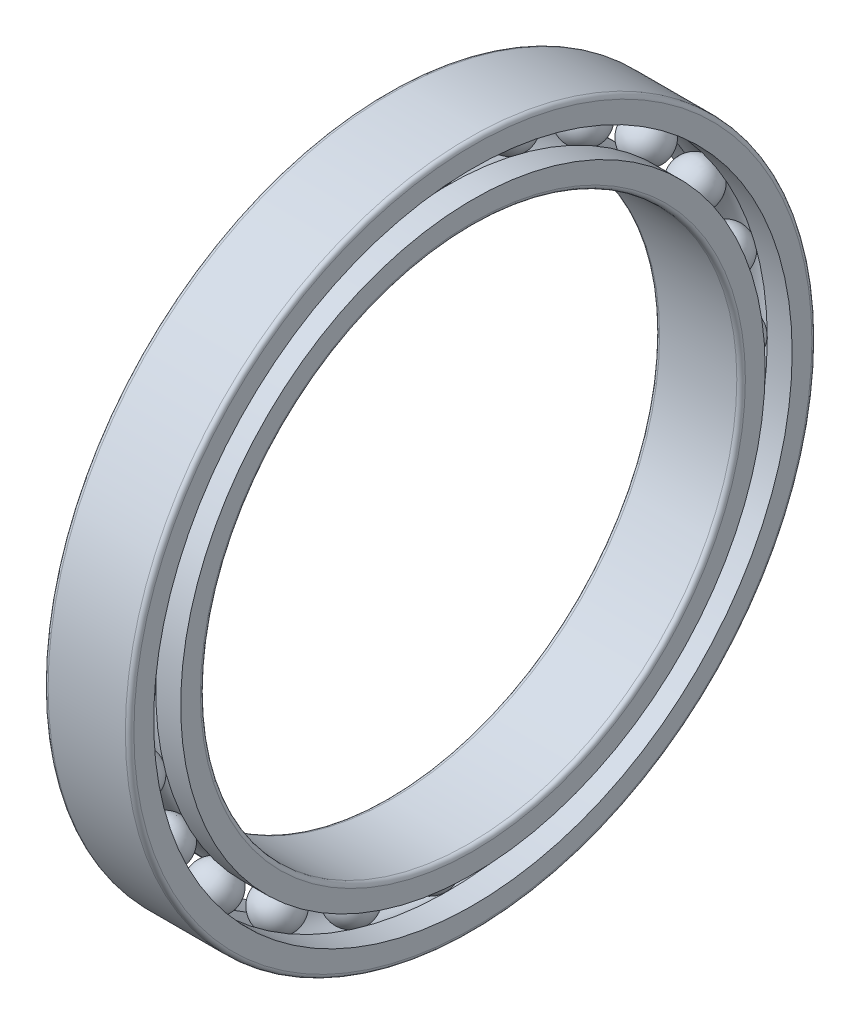
ISO-10303-21;
HEADER;
FILE_DESCRIPTION(('STEP AP214'),'2;1');
FILE_NAME('part.step','',(''),(''),'','','');
FILE_SCHEMA(('AUTOMOTIVE_DESIGN { 1 0 10303 214 1 1 1 1 }'));
ENDSEC;
DATA;
#1=APPLICATION_CONTEXT('core data for automotive mechanical design processes');
#2=APPLICATION_PROTOCOL_DEFINITION('international standard','automotive_design',2000,#1);
#3=PRODUCT_CONTEXT('',#1,'mechanical');
#4=PRODUCT('Part','Part','',(#3));
#5=PRODUCT_RELATED_PRODUCT_CATEGORY('part','',(#4));
#6=PRODUCT_DEFINITION_FORMATION('','',#4);
#7=PRODUCT_DEFINITION_CONTEXT('part definition',#1,'design');
#8=PRODUCT_DEFINITION('design','',#6,#7);
#9=PRODUCT_DEFINITION_SHAPE('','',#8);
#10=(LENGTH_UNIT() NAMED_UNIT(*) SI_UNIT(.MILLI.,.METRE.));
#11=(NAMED_UNIT(*) PLANE_ANGLE_UNIT() SI_UNIT($,.RADIAN.));
#12=(NAMED_UNIT(*) SI_UNIT($,.STERADIAN.) SOLID_ANGLE_UNIT());
#13=UNCERTAINTY_MEASURE_WITH_UNIT(LENGTH_MEASURE(1.E-05),#10,'distance_accuracy_value','');
#14=(GEOMETRIC_REPRESENTATION_CONTEXT(3) GLOBAL_UNCERTAINTY_ASSIGNED_CONTEXT((#13)) GLOBAL_UNIT_ASSIGNED_CONTEXT((#10,
#11,#12)) REPRESENTATION_CONTEXT('',''));
#15=CARTESIAN_POINT('',(0.,0.,0.));
#16=DIRECTION('',(0.,0.,1.));
#17=DIRECTION('',(1.,0.,0.));
#18=AXIS2_PLACEMENT_3D('',#15,#16,#17);
#19=CARTESIAN_POINT('',(2.,14.25,0.));
#20=DIRECTION('',(-1.,0.,0.));
#21=DIRECTION('',(0.,1.,0.));
#22=AXIS2_PLACEMENT_3D('',#19,#20,#21);
#23=SPHERICAL_SURFACE('',#22,1.0325);
#24=CARTESIAN_POINT('',(3.0325,14.25,0.));
#25=VERTEX_POINT('',#24);
#26=VERTEX_LOOP('',#25);
#27=FACE_BOUND('',#26,.T.);
#28=ADVANCED_FACE('P0_F14',(#27),#23,.T.);
#29=CLOSED_SHELL('',(#28));
#30=MANIFOLD_SOLID_BREP('P0_B1',#29);
#31=CARTESIAN_POINT('',(2.,13.764443024619,3.688171392711));
#32=DIRECTION('',(-1.,0.,0.));
#33=DIRECTION('',(0.,1.,0.));
#34=AXIS2_PLACEMENT_3D('',#31,#32,#33);
#35=SPHERICAL_SURFACE('',#34,1.0325);
#36=CARTESIAN_POINT('',(3.0325,13.764443024619,3.688171392711));
#37=VERTEX_POINT('',#36);
#38=VERTEX_LOOP('',#37);
#39=FACE_BOUND('',#38,.T.);
#40=ADVANCED_FACE('P1_F14',(#39),#35,.T.);
#41=CLOSED_SHELL('',(#40));
#42=MANIFOLD_SOLID_BREP('P1_B1',#41);
#43=CARTESIAN_POINT('',(2.,12.340862003928,7.125));
#44=DIRECTION('',(-1.,0.,0.));
#45=DIRECTION('',(0.,1.,0.));
#46=AXIS2_PLACEMENT_3D('',#43,#44,#45);
#47=SPHERICAL_SURFACE('',#46,1.0325);
#48=CARTESIAN_POINT('',(3.0325,12.340862003928,7.125));
#49=VERTEX_POINT('',#48);
#50=VERTEX_LOOP('',#49);
#51=FACE_BOUND('',#50,.T.);
#52=ADVANCED_FACE('P2_F14',(#51),#47,.T.);
#53=CLOSED_SHELL('',(#52));
#54=MANIFOLD_SOLID_BREP('P2_B1',#53);
#55=CARTESIAN_POINT('',(2.,10.076271631908,10.076271631908));
#56=DIRECTION('',(-1.,0.,0.));
#57=DIRECTION('',(0.,1.,0.));
#58=AXIS2_PLACEMENT_3D('',#55,#56,#57);
#59=SPHERICAL_SURFACE('',#58,1.0325);
#60=CARTESIAN_POINT('',(3.0325,10.076271631908,10.076271631908));
#61=VERTEX_POINT('',#60);
#62=VERTEX_LOOP('',#61);
#63=FACE_BOUND('',#62,.T.);
#64=ADVANCED_FACE('P3_F14',(#63),#59,.T.);
#65=CLOSED_SHELL('',(#64));
#66=MANIFOLD_SOLID_BREP('P3_B1',#65);
#67=CARTESIAN_POINT('',(2.,7.125,12.340862003928));
#68=DIRECTION('',(-1.,0.,0.));
#69=DIRECTION('',(0.,1.,0.));
#70=AXIS2_PLACEMENT_3D('',#67,#68,#69);
#71=SPHERICAL_SURFACE('',#70,1.0325);
#72=CARTESIAN_POINT('',(3.0325,7.125,12.340862003928));
#73=VERTEX_POINT('',#72);
#74=VERTEX_LOOP('',#73);
#75=FACE_BOUND('',#74,.T.);
#76=ADVANCED_FACE('P4_F14',(#75),#71,.T.);
#77=CLOSED_SHELL('',(#76));
#78=MANIFOLD_SOLID_BREP('P4_B1',#77);
#79=CARTESIAN_POINT('',(2.,3.688171392711,13.764443024619));
#80=DIRECTION('',(-1.,0.,0.));
#81=DIRECTION('',(0.,1.,0.));
#82=AXIS2_PLACEMENT_3D('',#79,#80,#81);
#83=SPHERICAL_SURFACE('',#82,1.0325);
#84=CARTESIAN_POINT('',(3.0325,3.688171392711,13.764443024619));
#85=VERTEX_POINT('',#84);
#86=VERTEX_LOOP('',#85);
#87=FACE_BOUND('',#86,.T.);
#88=ADVANCED_FACE('P5_F14',(#87),#83,.T.);
#89=CLOSED_SHELL('',(#88));
#90=MANIFOLD_SOLID_BREP('P5_B1',#89);
#91=CARTESIAN_POINT('',(2.,0.,14.25));
#92=DIRECTION('',(-1.,0.,0.));
#93=DIRECTION('',(0.,1.,0.));
#94=AXIS2_PLACEMENT_3D('',#91,#92,#93);
#95=SPHERICAL_SURFACE('',#94,1.0325);
#96=CARTESIAN_POINT('',(3.0325,0.,14.25));
#97=VERTEX_POINT('',#96);
#98=VERTEX_LOOP('',#97);
#99=FACE_BOUND('',#98,.T.);
#100=ADVANCED_FACE('P6_F14',(#99),#95,.T.);
#101=CLOSED_SHELL('',(#100));
#102=MANIFOLD_SOLID_BREP('P6_B1',#101);
#103=CARTESIAN_POINT('',(2.,-3.688171392711,13.764443024619));
#104=DIRECTION('',(-1.,0.,0.));
#105=DIRECTION('',(0.,1.,0.));
#106=AXIS2_PLACEMENT_3D('',#103,#104,#105);
#107=SPHERICAL_SURFACE('',#106,1.0325);
#108=CARTESIAN_POINT('',(3.0325,-3.688171392711,13.764443024619));
#109=VERTEX_POINT('',#108);
#110=VERTEX_LOOP('',#109);
#111=FACE_BOUND('',#110,.T.);
#112=ADVANCED_FACE('P7_F14',(#111),#107,.T.);
#113=CLOSED_SHELL('',(#112));
#114=MANIFOLD_SOLID_BREP('P7_B1',#113);
#115=CARTESIAN_POINT('',(2.,-10.076271631908,10.076271631908));
#116=DIRECTION('',(-1.,0.,0.));
#117=DIRECTION('',(0.,1.,0.));
#118=AXIS2_PLACEMENT_3D('',#115,#116,#117);
#119=SPHERICAL_SURFACE('',#118,1.0325);
#120=CARTESIAN_POINT('',(3.0325,-10.076271631908,10.076271631908));
#121=VERTEX_POINT('',#120);
#122=VERTEX_LOOP('',#121);
#123=FACE_BOUND('',#122,.T.);
#124=ADVANCED_FACE('P8_F14',(#123),#119,.T.);
#125=CLOSED_SHELL('',(#124));
#126=MANIFOLD_SOLID_BREP('P8_B1',#125);
#127=CARTESIAN_POINT('',(2.,-12.340862003928,7.125));
#128=DIRECTION('',(-1.,0.,0.));
#129=DIRECTION('',(0.,1.,0.));
#130=AXIS2_PLACEMENT_3D('',#127,#128,#129);
#131=SPHERICAL_SURFACE('',#130,1.0325);
#132=CARTESIAN_POINT('',(3.0325,-12.340862003928,7.125));
#133=VERTEX_POINT('',#132);
#134=VERTEX_LOOP('',#133);
#135=FACE_BOUND('',#134,.T.);
#136=ADVANCED_FACE('P9_F14',(#135),#131,.T.);
#137=CLOSED_SHELL('',(#136));
#138=MANIFOLD_SOLID_BREP('P9_B1',#137);
#139=CARTESIAN_POINT('',(2.,-13.764443024619,3.688171392711));
#140=DIRECTION('',(-1.,0.,0.));
#141=DIRECTION('',(0.,1.,0.));
#142=AXIS2_PLACEMENT_3D('',#139,#140,#141);
#143=SPHERICAL_SURFACE('',#142,1.0325);
#144=CARTESIAN_POINT('',(3.0325,-13.764443024619,3.688171392711));
#145=VERTEX_POINT('',#144);
#146=VERTEX_LOOP('',#145);
#147=FACE_BOUND('',#146,.T.);
#148=ADVANCED_FACE('P10_F14',(#147),#143,.T.);
#149=CLOSED_SHELL('',(#148));
#150=MANIFOLD_SOLID_BREP('P10_B1',#149);
#151=CARTESIAN_POINT('',(2.,-14.25,0.));
#152=DIRECTION('',(-1.,0.,0.));
#153=DIRECTION('',(0.,1.,0.));
#154=AXIS2_PLACEMENT_3D('',#151,#152,#153);
#155=SPHERICAL_SURFACE('',#154,1.0325);
#156=CARTESIAN_POINT('',(3.0325,-14.25,0.));
#157=VERTEX_POINT('',#156);
#158=VERTEX_LOOP('',#157);
#159=FACE_BOUND('',#158,.T.);
#160=ADVANCED_FACE('P11_F14',(#159),#155,.T.);
#161=CLOSED_SHELL('',(#160));
#162=MANIFOLD_SOLID_BREP('P11_B1',#161);
#163=CARTESIAN_POINT('',(2.,-13.764443024619,-3.688171392711));
#164=DIRECTION('',(-1.,0.,0.));
#165=DIRECTION('',(0.,1.,0.));
#166=AXIS2_PLACEMENT_3D('',#163,#164,#165);
#167=SPHERICAL_SURFACE('',#166,1.0325);
#168=CARTESIAN_POINT('',(3.0325,-13.764443024619,-3.688171392711));
#169=VERTEX_POINT('',#168);
#170=VERTEX_LOOP('',#169);
#171=FACE_BOUND('',#170,.T.);
#172=ADVANCED_FACE('P12_F14',(#171),#167,.T.);
#173=CLOSED_SHELL('',(#172));
#174=MANIFOLD_SOLID_BREP('P12_B1',#173);
#175=CARTESIAN_POINT('',(2.,-12.340862003928,-7.125));
#176=DIRECTION('',(-1.,0.,0.));
#177=DIRECTION('',(0.,1.,0.));
#178=AXIS2_PLACEMENT_3D('',#175,#176,#177);
#179=SPHERICAL_SURFACE('',#178,1.0325);
#180=CARTESIAN_POINT('',(3.0325,-12.340862003928,-7.125));
#181=VERTEX_POINT('',#180);
#182=VERTEX_LOOP('',#181);
#183=FACE_BOUND('',#182,.T.);
#184=ADVANCED_FACE('P13_F14',(#183),#179,.T.);
#185=CLOSED_SHELL('',(#184));
#186=MANIFOLD_SOLID_BREP('P13_B1',#185);
#187=CARTESIAN_POINT('',(2.,-10.076271631908,-10.076271631908));
#188=DIRECTION('',(-1.,0.,0.));
#189=DIRECTION('',(0.,1.,0.));
#190=AXIS2_PLACEMENT_3D('',#187,#188,#189);
#191=SPHERICAL_SURFACE('',#190,1.0325);
#192=CARTESIAN_POINT('',(3.0325,-10.076271631908,-10.076271631908));
#193=VERTEX_POINT('',#192);
#194=VERTEX_LOOP('',#193);
#195=FACE_BOUND('',#194,.T.);
#196=ADVANCED_FACE('P14_F14',(#195),#191,.T.);
#197=CLOSED_SHELL('',(#196));
#198=MANIFOLD_SOLID_BREP('P14_B1',#197);
#199=CARTESIAN_POINT('',(2.,-7.125,-12.340862003928));
#200=DIRECTION('',(-1.,0.,0.));
#201=DIRECTION('',(0.,1.,0.));
#202=AXIS2_PLACEMENT_3D('',#199,#200,#201);
#203=SPHERICAL_SURFACE('',#202,1.0325);
#204=CARTESIAN_POINT('',(3.0325,-7.125,-12.340862003928));
#205=VERTEX_POINT('',#204);
#206=VERTEX_LOOP('',#205);
#207=FACE_BOUND('',#206,.T.);
#208=ADVANCED_FACE('P15_F14',(#207),#203,.T.);
#209=CLOSED_SHELL('',(#208));
#210=MANIFOLD_SOLID_BREP('P15_B1',#209);
#211=CARTESIAN_POINT('',(2.,-3.688171392711,-13.764443024619));
#212=DIRECTION('',(-1.,0.,0.));
#213=DIRECTION('',(0.,1.,0.));
#214=AXIS2_PLACEMENT_3D('',#211,#212,#213);
#215=SPHERICAL_SURFACE('',#214,1.0325);
#216=CARTESIAN_POINT('',(3.0325,-3.688171392711,-13.764443024619));
#217=VERTEX_POINT('',#216);
#218=VERTEX_LOOP('',#217);
#219=FACE_BOUND('',#218,.T.);
#220=ADVANCED_FACE('P16_F14',(#219),#215,.T.);
#221=CLOSED_SHELL('',(#220));
#222=MANIFOLD_SOLID_BREP('P16_B1',#221);
#223=CARTESIAN_POINT('',(2.,0.,-14.25));
#224=DIRECTION('',(-1.,0.,0.));
#225=DIRECTION('',(0.,1.,0.));
#226=AXIS2_PLACEMENT_3D('',#223,#224,#225);
#227=SPHERICAL_SURFACE('',#226,1.0325);
#228=CARTESIAN_POINT('',(3.0325,0.,-14.25));
#229=VERTEX_POINT('',#228);
#230=VERTEX_LOOP('',#229);
#231=FACE_BOUND('',#230,.T.);
#232=ADVANCED_FACE('P17_F14',(#231),#227,.T.);
#233=CLOSED_SHELL('',(#232));
#234=MANIFOLD_SOLID_BREP('P17_B1',#233);
#235=CARTESIAN_POINT('',(2.,3.688171392711,-13.764443024619));
#236=DIRECTION('',(-1.,0.,0.));
#237=DIRECTION('',(0.,1.,0.));
#238=AXIS2_PLACEMENT_3D('',#235,#236,#237);
#239=SPHERICAL_SURFACE('',#238,1.0325);
#240=CARTESIAN_POINT('',(3.0325,3.688171392711,-13.764443024619));
#241=VERTEX_POINT('',#240);
#242=VERTEX_LOOP('',#241);
#243=FACE_BOUND('',#242,.T.);
#244=ADVANCED_FACE('P18_F14',(#243),#239,.T.);
#245=CLOSED_SHELL('',(#244));
#246=MANIFOLD_SOLID_BREP('P18_B1',#245);
#247=CARTESIAN_POINT('',(2.,7.125,-12.340862003928));
#248=DIRECTION('',(-1.,0.,0.));
#249=DIRECTION('',(0.,1.,0.));
#250=AXIS2_PLACEMENT_3D('',#247,#248,#249);
#251=SPHERICAL_SURFACE('',#250,1.0325);
#252=CARTESIAN_POINT('',(3.0325,7.125,-12.340862003928));
#253=VERTEX_POINT('',#252);
#254=VERTEX_LOOP('',#253);
#255=FACE_BOUND('',#254,.T.);
#256=ADVANCED_FACE('P19_F14',(#255),#251,.T.);
#257=CLOSED_SHELL('',(#256));
#258=MANIFOLD_SOLID_BREP('P19_B1',#257);
#259=CARTESIAN_POINT('',(2.,10.076271631908,-10.076271631908));
#260=DIRECTION('',(-1.,0.,0.));
#261=DIRECTION('',(0.,1.,0.));
#262=AXIS2_PLACEMENT_3D('',#259,#260,#261);
#263=SPHERICAL_SURFACE('',#262,1.0325);
#264=CARTESIAN_POINT('',(3.0325,10.076271631908,-10.076271631908));
#265=VERTEX_POINT('',#264);
#266=VERTEX_LOOP('',#265);
#267=FACE_BOUND('',#266,.T.);
#268=ADVANCED_FACE('P20_F14',(#267),#263,.T.);
#269=CLOSED_SHELL('',(#268));
#270=MANIFOLD_SOLID_BREP('P20_B1',#269);
#271=CARTESIAN_POINT('',(2.,12.340862003928,-7.125));
#272=DIRECTION('',(-1.,0.,0.));
#273=DIRECTION('',(0.,1.,0.));
#274=AXIS2_PLACEMENT_3D('',#271,#272,#273);
#275=SPHERICAL_SURFACE('',#274,1.0325);
#276=CARTESIAN_POINT('',(3.0325,12.340862003928,-7.125));
#277=VERTEX_POINT('',#276);
#278=VERTEX_LOOP('',#277);
#279=FACE_BOUND('',#278,.T.);
#280=ADVANCED_FACE('P21_F14',(#279),#275,.T.);
#281=CLOSED_SHELL('',(#280));
#282=MANIFOLD_SOLID_BREP('P21_B1',#281);
#283=CARTESIAN_POINT('',(2.,13.764443024619,-3.688171392711));
#284=DIRECTION('',(-1.,0.,0.));
#285=DIRECTION('',(0.,1.,0.));
#286=AXIS2_PLACEMENT_3D('',#283,#284,#285);
#287=SPHERICAL_SURFACE('',#286,1.0325);
#288=CARTESIAN_POINT('',(3.0325,13.764443024619,-3.688171392711));
#289=VERTEX_POINT('',#288);
#290=VERTEX_LOOP('',#289);
#291=FACE_BOUND('',#290,.T.);
#292=ADVANCED_FACE('P22_F14',(#291),#287,.T.);
#293=CLOSED_SHELL('',(#292));
#294=MANIFOLD_SOLID_BREP('P22_B1',#293);
#295=CARTESIAN_POINT('',(2.,-7.125,12.340862003928));
#296=DIRECTION('',(-1.,0.,0.));
#297=DIRECTION('',(0.,1.,0.));
#298=AXIS2_PLACEMENT_3D('',#295,#296,#297);
#299=SPHERICAL_SURFACE('',#298,1.0325);
#300=CARTESIAN_POINT('',(3.0325,-7.125,12.340862003928));
#301=VERTEX_POINT('',#300);
#302=VERTEX_LOOP('',#301);
#303=FACE_BOUND('',#302,.T.);
#304=ADVANCED_FACE('P23_F14',(#303),#299,.T.);
#305=CLOSED_SHELL('',(#304));
#306=MANIFOLD_SOLID_BREP('P23_B1',#305);
#307=CARTESIAN_POINT('',(4.,0.,0.));
#308=DIRECTION('',(1.,0.,0.));
#309=DIRECTION('',(0.,0.,-1.));
#310=AXIS2_PLACEMENT_3D('',#307,#308,#309);
#311=CYLINDRICAL_SURFACE('',#310,13.62);
#312=CARTESIAN_POINT('',(1.16,0.,0.));
#313=DIRECTION('',(1.,0.,0.));
#314=DIRECTION('',(0.,0.,-1.));
#315=AXIS2_PLACEMENT_3D('',#312,#313,#314);
#316=CIRCLE('',#315,13.62);
#317=CARTESIAN_POINT('',(1.16,0.,-13.62));
#318=VERTEX_POINT('',#317);
#319=EDGE_CURVE('P24_E11',#318,#318,#316,.T.);
#320=ORIENTED_EDGE('',*,*,#319,.F.);
#321=EDGE_LOOP('',(#320));
#322=FACE_BOUND('',#321,.T.);
#323=CARTESIAN_POINT('',(0.,0.,0.));
#324=DIRECTION('',(1.,0.,0.));
#325=DIRECTION('',(0.,0.,-1.));
#326=AXIS2_PLACEMENT_3D('',#323,#324,#325);
#327=CIRCLE('',#326,13.62);
#328=CARTESIAN_POINT('',(0.,0.,-13.62));
#329=VERTEX_POINT('',#328);
#330=EDGE_CURVE('P24_E71',#329,#329,#327,.T.);
#331=ORIENTED_EDGE('',*,*,#330,.T.);
#332=EDGE_LOOP('',(#331));
#333=FACE_BOUND('',#332,.T.);
#334=ADVANCED_FACE('P24_F16',(#322,#333),#311,.T.);
#335=CARTESIAN_POINT('',(2.,0.,0.));
#336=DIRECTION('',(1.,0.,0.));
#337=DIRECTION('',(0.,0.,-1.));
#338=AXIS2_PLACEMENT_3D('',#335,#336,#337);
#339=TOROIDAL_SURFACE('',#338,14.25,1.05);
#340=ORIENTED_EDGE('',*,*,#319,.T.);
#341=EDGE_LOOP('',(#340));
#342=FACE_BOUND('',#341,.T.);
#343=CARTESIAN_POINT('',(2.84,0.,0.));
#344=DIRECTION('',(1.,0.,0.));
#345=DIRECTION('',(0.,0.,-1.));
#346=AXIS2_PLACEMENT_3D('',#343,#344,#345);
#347=CIRCLE('',#346,13.62);
#348=CARTESIAN_POINT('',(2.84,0.,-13.62));
#349=VERTEX_POINT('',#348);
#350=EDGE_CURVE('P24_E25',#349,#349,#347,.T.);
#351=ORIENTED_EDGE('',*,*,#350,.F.);
#352=EDGE_LOOP('',(#351));
#353=FACE_BOUND('',#352,.T.);
#354=ADVANCED_FACE('P24_F164',(#342,#353),#339,.F.);
#355=CARTESIAN_POINT('',(4.,0.,0.));
#356=DIRECTION('',(1.,0.,0.));
#357=DIRECTION('',(0.,0.,-1.));
#358=AXIS2_PLACEMENT_3D('',#355,#356,#357);
#359=CYLINDRICAL_SURFACE('',#358,13.62);
#360=CARTESIAN_POINT('',(4.,0.,0.));
#361=DIRECTION('',(1.,0.,0.));
#362=DIRECTION('',(0.,0.,-1.));
#363=AXIS2_PLACEMENT_3D('',#360,#361,#362);
#364=CIRCLE('',#363,13.62);
#365=CARTESIAN_POINT('',(4.,0.,-13.62));
#366=VERTEX_POINT('',#365);
#367=EDGE_CURVE('P24_E45',#366,#366,#364,.T.);
#368=ORIENTED_EDGE('',*,*,#367,.F.);
#369=EDGE_LOOP('',(#368));
#370=FACE_BOUND('',#369,.T.);
#371=ORIENTED_EDGE('',*,*,#350,.T.);
#372=EDGE_LOOP('',(#371));
#373=FACE_BOUND('',#372,.T.);
#374=ADVANCED_FACE('P24_F155',(#370,#373),#359,.T.);
#375=CARTESIAN_POINT('',(4.,12.7,0.));
#376=DIRECTION('',(1.,0.,0.));
#377=DIRECTION('',(0.,1.,0.));
#378=AXIS2_PLACEMENT_3D('',#375,#376,#377);
#379=PLANE('',#378);
#380=CARTESIAN_POINT('',(4.,0.,0.));
#381=DIRECTION('',(1.,0.,0.));
#382=DIRECTION('',(0.,0.,-1.));
#383=AXIS2_PLACEMENT_3D('',#380,#381,#382);
#384=CIRCLE('',#383,12.7);
#385=CARTESIAN_POINT('',(4.,0.,-12.7));
#386=VERTEX_POINT('',#385);
#387=EDGE_CURVE('P24_E53',#386,#386,#384,.T.);
#388=ORIENTED_EDGE('',*,*,#387,.F.);
#389=EDGE_LOOP('',(#388));
#390=FACE_BOUND('',#389,.T.);
#391=ORIENTED_EDGE('',*,*,#367,.T.);
#392=EDGE_LOOP('',(#391));
#393=FACE_BOUND('',#392,.T.);
#394=ADVANCED_FACE('P24_F132',(#390,#393),#379,.T.);
#395=CARTESIAN_POINT('',(3.8,0.,0.));
#396=DIRECTION('',(1.,0.,0.));
#397=DIRECTION('',(0.,0.,-1.));
#398=AXIS2_PLACEMENT_3D('',#395,#396,#397);
#399=TOROIDAL_SURFACE('',#398,12.7,0.2);
#400=CARTESIAN_POINT('',(3.8,0.,0.));
#401=DIRECTION('',(1.,0.,0.));
#402=DIRECTION('',(0.,0.,-1.));
#403=AXIS2_PLACEMENT_3D('',#400,#401,#402);
#404=CIRCLE('',#403,12.5);
#405=CARTESIAN_POINT('',(3.8,0.,-12.5));
#406=VERTEX_POINT('',#405);
#407=EDGE_CURVE('P24_E84',#406,#406,#404,.T.);
#408=ORIENTED_EDGE('',*,*,#407,.F.);
#409=EDGE_LOOP('',(#408));
#410=FACE_BOUND('',#409,.T.);
#411=ORIENTED_EDGE('',*,*,#387,.T.);
#412=EDGE_LOOP('',(#411));
#413=FACE_BOUND('',#412,.T.);
#414=ADVANCED_FACE('P24_F126',(#410,#413),#399,.T.);
#415=CARTESIAN_POINT('',(4.,0.,0.));
#416=DIRECTION('',(1.,0.,0.));
#417=DIRECTION('',(0.,0.,-1.));
#418=AXIS2_PLACEMENT_3D('',#415,#416,#417);
#419=CYLINDRICAL_SURFACE('',#418,12.5);
#420=CARTESIAN_POINT('',(0.2,0.,0.));
#421=DIRECTION('',(1.,0.,0.));
#422=DIRECTION('',(0.,0.,-1.));
#423=AXIS2_PLACEMENT_3D('',#420,#421,#422);
#424=CIRCLE('',#423,12.5);
#425=CARTESIAN_POINT('',(0.2,0.,-12.5));
#426=VERTEX_POINT('',#425);
#427=EDGE_CURVE('P24_E77',#426,#426,#424,.T.);
#428=ORIENTED_EDGE('',*,*,#427,.F.);
#429=EDGE_LOOP('',(#428));
#430=FACE_BOUND('',#429,.T.);
#431=ORIENTED_EDGE('',*,*,#407,.T.);
#432=EDGE_LOOP('',(#431));
#433=FACE_BOUND('',#432,.T.);
#434=ADVANCED_FACE('P24_F131',(#430,#433),#419,.F.);
#435=CARTESIAN_POINT('',(0.2,0.,0.));
#436=DIRECTION('',(1.,0.,0.));
#437=DIRECTION('',(0.,0.,-1.));
#438=AXIS2_PLACEMENT_3D('',#435,#436,#437);
#439=TOROIDAL_SURFACE('',#438,12.7,0.2);
#440=CARTESIAN_POINT('',(0.,0.,0.));
#441=DIRECTION('',(1.,0.,0.));
#442=DIRECTION('',(0.,0.,-1.));
#443=AXIS2_PLACEMENT_3D('',#440,#441,#442);
#444=CIRCLE('',#443,12.7);
#445=CARTESIAN_POINT('',(0.,0.,-12.7));
#446=VERTEX_POINT('',#445);
#447=EDGE_CURVE('P24_E67',#446,#446,#444,.T.);
#448=ORIENTED_EDGE('',*,*,#447,.F.);
#449=EDGE_LOOP('',(#448));
#450=FACE_BOUND('',#449,.T.);
#451=ORIENTED_EDGE('',*,*,#427,.T.);
#452=EDGE_LOOP('',(#451));
#453=FACE_BOUND('',#452,.T.);
#454=ADVANCED_FACE('P24_F120',(#450,#453),#439,.T.);
#455=CARTESIAN_POINT('',(0.,13.62,0.));
#456=DIRECTION('',(-1.,0.,0.));
#457=DIRECTION('',(0.,0.,1.));
#458=AXIS2_PLACEMENT_3D('',#455,#456,#457);
#459=PLANE('',#458);
#460=ORIENTED_EDGE('',*,*,#330,.F.);
#461=EDGE_LOOP('',(#460));
#462=FACE_BOUND('',#461,.T.);
#463=ORIENTED_EDGE('',*,*,#447,.T.);
#464=EDGE_LOOP('',(#463));
#465=FACE_BOUND('',#464,.T.);
#466=ADVANCED_FACE('P24_F68',(#462,#465),#459,.T.);
#467=CLOSED_SHELL('',(#334,#354,#374,#394,#414,#434,#454,#466));
#468=MANIFOLD_SOLID_BREP('P24_B1',#467);
#469=CARTESIAN_POINT('',(0.2,0.,0.));
#470=DIRECTION('',(1.,0.,0.));
#471=DIRECTION('',(0.,0.,-1.));
#472=AXIS2_PLACEMENT_3D('',#469,#470,#471);
#473=TOROIDAL_SURFACE('',#472,15.8,0.2);
#474=CARTESIAN_POINT('',(0.2,0.,0.));
#475=DIRECTION('',(1.,0.,0.));
#476=DIRECTION('',(0.,0.,-1.));
#477=AXIS2_PLACEMENT_3D('',#474,#475,#476);
#478=CIRCLE('',#477,16.);
#479=CARTESIAN_POINT('',(0.2,0.,-16.));
#480=VERTEX_POINT('',#479);
#481=EDGE_CURVE('P25_E11',#480,#480,#478,.T.);
#482=ORIENTED_EDGE('',*,*,#481,.F.);
#483=EDGE_LOOP('',(#482));
#484=FACE_BOUND('',#483,.T.);
#485=CARTESIAN_POINT('',(0.,0.,0.));
#486=DIRECTION('',(1.,0.,0.));
#487=DIRECTION('',(0.,0.,-1.));
#488=AXIS2_PLACEMENT_3D('',#485,#486,#487);
#489=CIRCLE('',#488,15.8);
#490=CARTESIAN_POINT('',(0.,0.,-15.8));
#491=VERTEX_POINT('',#490);
#492=EDGE_CURVE('P25_E83',#491,#491,#489,.T.);
#493=ORIENTED_EDGE('',*,*,#492,.T.);
#494=EDGE_LOOP('',(#493));
#495=FACE_BOUND('',#494,.T.);
#496=ADVANCED_FACE('P25_F16',(#484,#495),#473,.T.);
#497=CARTESIAN_POINT('',(4.,0.,0.));
#498=DIRECTION('',(1.,0.,0.));
#499=DIRECTION('',(0.,0.,-1.));
#500=AXIS2_PLACEMENT_3D('',#497,#498,#499);
#501=CYLINDRICAL_SURFACE('',#500,16.);
#502=CARTESIAN_POINT('',(3.8,0.,0.));
#503=DIRECTION('',(1.,0.,0.));
#504=DIRECTION('',(0.,0.,-1.));
#505=AXIS2_PLACEMENT_3D('',#502,#503,#504);
#506=CIRCLE('',#505,16.);
#507=CARTESIAN_POINT('',(3.8,0.,-16.));
#508=VERTEX_POINT('',#507);
#509=EDGE_CURVE('P25_E27',#508,#508,#506,.T.);
#510=ORIENTED_EDGE('',*,*,#509,.F.);
#511=EDGE_LOOP('',(#510));
#512=FACE_BOUND('',#511,.T.);
#513=ORIENTED_EDGE('',*,*,#481,.T.);
#514=EDGE_LOOP('',(#513));
#515=FACE_BOUND('',#514,.T.);
#516=ADVANCED_FACE('P25_F18',(#512,#515),#501,.T.);
#517=CARTESIAN_POINT('',(3.8,0.,0.));
#518=DIRECTION('',(1.,0.,0.));
#519=DIRECTION('',(0.,0.,-1.));
#520=AXIS2_PLACEMENT_3D('',#517,#518,#519);
#521=TOROIDAL_SURFACE('',#520,15.8,0.2);
#522=CARTESIAN_POINT('',(4.,0.,0.));
#523=DIRECTION('',(1.,0.,0.));
#524=DIRECTION('',(0.,0.,-1.));
#525=AXIS2_PLACEMENT_3D('',#522,#523,#524);
#526=CIRCLE('',#525,15.8);
#527=CARTESIAN_POINT('',(4.,0.,-15.8));
#528=VERTEX_POINT('',#527);
#529=EDGE_CURVE('P25_E20',#528,#528,#526,.T.);
#530=ORIENTED_EDGE('',*,*,#529,.F.);
#531=EDGE_LOOP('',(#530));
#532=FACE_BOUND('',#531,.T.);
#533=ORIENTED_EDGE('',*,*,#509,.T.);
#534=EDGE_LOOP('',(#533));
#535=FACE_BOUND('',#534,.T.);
#536=ADVANCED_FACE('P25_F119',(#532,#535),#521,.T.);
#537=CARTESIAN_POINT('',(4.,14.88,0.));
#538=DIRECTION('',(1.,0.,0.));
#539=DIRECTION('',(0.,1.,0.));
#540=AXIS2_PLACEMENT_3D('',#537,#538,#539);
#541=PLANE('',#540);
#542=CARTESIAN_POINT('',(4.,0.,0.));
#543=DIRECTION('',(1.,0.,0.));
#544=DIRECTION('',(0.,0.,-1.));
#545=AXIS2_PLACEMENT_3D('',#542,#543,#544);
#546=CIRCLE('',#545,14.88);
#547=CARTESIAN_POINT('',(4.,0.,-14.88));
#548=VERTEX_POINT('',#547);
#549=EDGE_CURVE('P25_E65',#548,#548,#546,.T.);
#550=ORIENTED_EDGE('',*,*,#549,.F.);
#551=EDGE_LOOP('',(#550));
#552=FACE_BOUND('',#551,.T.);
#553=ORIENTED_EDGE('',*,*,#529,.T.);
#554=EDGE_LOOP('',(#553));
#555=FACE_BOUND('',#554,.T.);
#556=ADVANCED_FACE('P25_F62',(#552,#555),#541,.T.);
#557=CARTESIAN_POINT('',(4.,0.,0.));
#558=DIRECTION('',(1.,0.,0.));
#559=DIRECTION('',(0.,0.,-1.));
#560=AXIS2_PLACEMENT_3D('',#557,#558,#559);
#561=CYLINDRICAL_SURFACE('',#560,14.88);
#562=CARTESIAN_POINT('',(2.84,0.,0.));
#563=DIRECTION('',(1.,0.,0.));
#564=DIRECTION('',(0.,0.,-1.));
#565=AXIS2_PLACEMENT_3D('',#562,#563,#564);
#566=CIRCLE('',#565,14.88);
#567=CARTESIAN_POINT('',(2.84,0.,-14.88));
#568=VERTEX_POINT('',#567);
#569=EDGE_CURVE('P25_E72',#568,#568,#566,.T.);
#570=ORIENTED_EDGE('',*,*,#569,.F.);
#571=EDGE_LOOP('',(#570));
#572=FACE_BOUND('',#571,.T.);
#573=ORIENTED_EDGE('',*,*,#549,.T.);
#574=EDGE_LOOP('',(#573));
#575=FACE_BOUND('',#574,.T.);
#576=ADVANCED_FACE('P25_F103',(#572,#575),#561,.F.);
#577=CARTESIAN_POINT('',(2.,0.,0.));
#578=DIRECTION('',(1.,0.,0.));
#579=DIRECTION('',(0.,0.,-1.));
#580=AXIS2_PLACEMENT_3D('',#577,#578,#579);
#581=TOROIDAL_SURFACE('',#580,14.25,1.05);
#582=ORIENTED_EDGE('',*,*,#569,.T.);
#583=EDGE_LOOP('',(#582));
#584=FACE_BOUND('',#583,.T.);
#585=CARTESIAN_POINT('',(1.16,0.,0.));
#586=DIRECTION('',(1.,0.,0.));
#587=DIRECTION('',(0.,0.,-1.));
#588=AXIS2_PLACEMENT_3D('',#585,#586,#587);
#589=CIRCLE('',#588,14.88);
#590=CARTESIAN_POINT('',(1.16,0.,-14.88));
#591=VERTEX_POINT('',#590);
#592=EDGE_CURVE('P25_E78',#591,#591,#589,.T.);
#593=ORIENTED_EDGE('',*,*,#592,.F.);
#594=EDGE_LOOP('',(#593));
#595=FACE_BOUND('',#594,.T.);
#596=ADVANCED_FACE('P25_F98',(#584,#595),#581,.F.);
#597=CARTESIAN_POINT('',(4.,0.,0.));
#598=DIRECTION('',(1.,0.,0.));
#599=DIRECTION('',(0.,0.,-1.));
#600=AXIS2_PLACEMENT_3D('',#597,#598,#599);
#601=CYLINDRICAL_SURFACE('',#600,14.88);
#602=CARTESIAN_POINT('',(0.,0.,0.));
#603=DIRECTION('',(1.,0.,0.));
#604=DIRECTION('',(0.,0.,-1.));
#605=AXIS2_PLACEMENT_3D('',#602,#603,#604);
#606=CIRCLE('',#605,14.88);
#607=CARTESIAN_POINT('',(0.,0.,-14.88));
#608=VERTEX_POINT('',#607);
#609=EDGE_CURVE('P25_E86',#608,#608,#606,.T.);
#610=ORIENTED_EDGE('',*,*,#609,.F.);
#611=EDGE_LOOP('',(#610));
#612=FACE_BOUND('',#611,.T.);
#613=ORIENTED_EDGE('',*,*,#592,.T.);
#614=EDGE_LOOP('',(#613));
#615=FACE_BOUND('',#614,.T.);
#616=ADVANCED_FACE('P25_F95',(#612,#615),#601,.F.);
#617=CARTESIAN_POINT('',(0.,15.8,0.));
#618=DIRECTION('',(-1.,0.,0.));
#619=DIRECTION('',(0.,0.,1.));
#620=AXIS2_PLACEMENT_3D('',#617,#618,#619);
#621=PLANE('',#620);
#622=ORIENTED_EDGE('',*,*,#492,.F.);
#623=EDGE_LOOP('',(#622));
#624=FACE_BOUND('',#623,.T.);
#625=ORIENTED_EDGE('',*,*,#609,.T.);
#626=EDGE_LOOP('',(#625));
#627=FACE_BOUND('',#626,.T.);
#628=ADVANCED_FACE('P25_F93',(#624,#627),#621,.T.);
#629=CLOSED_SHELL('',(#496,#516,#536,#556,#576,#596,#616,#628));
#630=MANIFOLD_SOLID_BREP('P25_B1',#629);
#631=ADVANCED_BREP_SHAPE_REPRESENTATION('',(#18,#30,#42,#54,#66,#78,#90,#102,#114,#126,#138,
#150,#162,#174,#186,#198,#210,#222,#234,#246,#258,#270,#282,#294,#306,#468,#630),#14);
#632=SHAPE_DEFINITION_REPRESENTATION(#9,#631);
ENDSEC;
END-ISO-10303-21;
